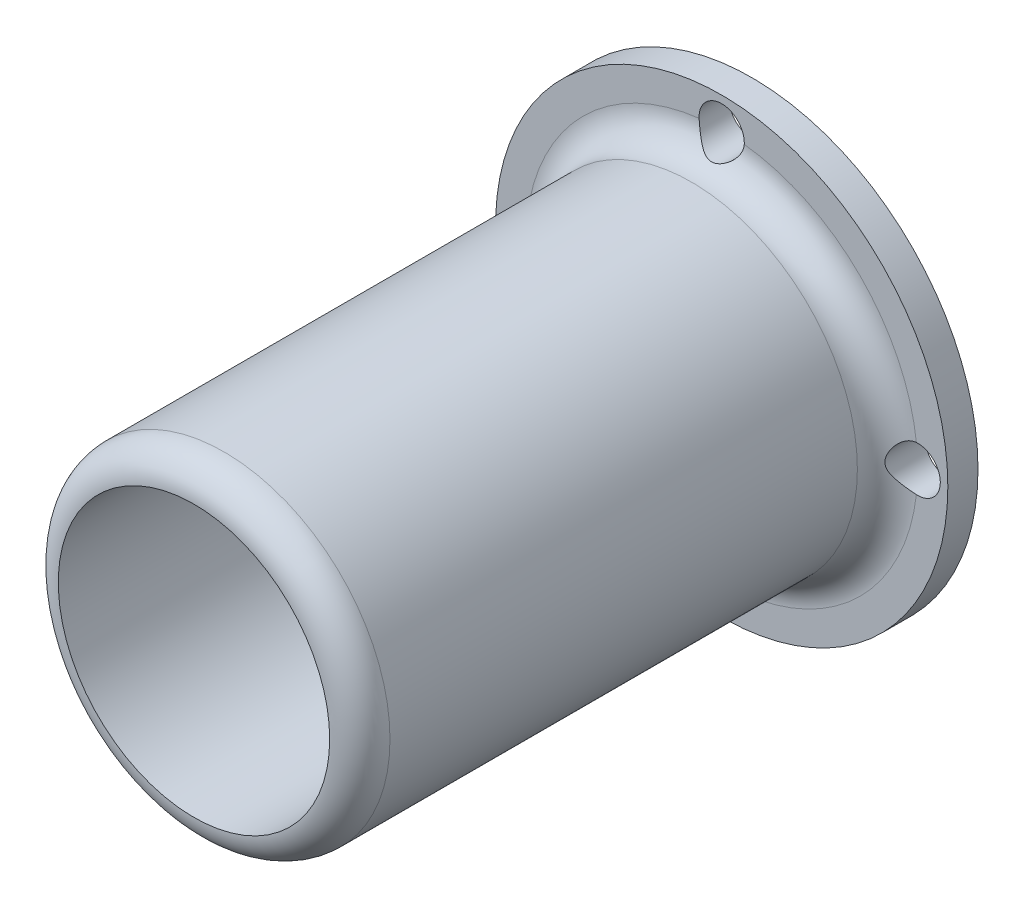
ISO-10303-21;
HEADER;
FILE_DESCRIPTION(('STEP AP214'),'2;1');
FILE_NAME('part.step','',(''),(''),'','','');
FILE_SCHEMA(('AUTOMOTIVE_DESIGN { 1 0 10303 214 1 1 1 1 }'));
ENDSEC;
DATA;
#1=APPLICATION_CONTEXT('core data for automotive mechanical design processes');
#2=APPLICATION_PROTOCOL_DEFINITION('international standard','automotive_design',2000,#1);
#3=PRODUCT_CONTEXT('',#1,'mechanical');
#4=PRODUCT('Part','Part','',(#3));
#5=PRODUCT_RELATED_PRODUCT_CATEGORY('part','',(#4));
#6=PRODUCT_DEFINITION_FORMATION('','',#4);
#7=PRODUCT_DEFINITION_CONTEXT('part definition',#1,'design');
#8=PRODUCT_DEFINITION('design','',#6,#7);
#9=PRODUCT_DEFINITION_SHAPE('','',#8);
#10=(LENGTH_UNIT() NAMED_UNIT(*) SI_UNIT(.MILLI.,.METRE.));
#11=(NAMED_UNIT(*) PLANE_ANGLE_UNIT() SI_UNIT($,.RADIAN.));
#12=(NAMED_UNIT(*) SI_UNIT($,.STERADIAN.) SOLID_ANGLE_UNIT());
#13=UNCERTAINTY_MEASURE_WITH_UNIT(LENGTH_MEASURE(1.E-05),#10,'distance_accuracy_value','');
#14=(GEOMETRIC_REPRESENTATION_CONTEXT(3) GLOBAL_UNCERTAINTY_ASSIGNED_CONTEXT((#13)) GLOBAL_UNIT_ASSIGNED_CONTEXT((#10,
#11,#12)) REPRESENTATION_CONTEXT('',''));
#15=CARTESIAN_POINT('',(0.,0.,0.));
#16=DIRECTION('',(0.,0.,1.));
#17=DIRECTION('',(1.,0.,0.));
#18=AXIS2_PLACEMENT_3D('',#15,#16,#17);
#19=CARTESIAN_POINT('',(0.,0.,2.));
#20=DIRECTION('',(0.,0.,-1.));
#21=DIRECTION('',(-1.,0.,0.));
#22=AXIS2_PLACEMENT_3D('',#19,#20,#21);
#23=CYLINDRICAL_SURFACE('',#22,15.);
#24=CARTESIAN_POINT('',(0.,0.,2.));
#25=DIRECTION('',(0.,0.,1.));
#26=DIRECTION('',(1.,0.,0.));
#27=AXIS2_PLACEMENT_3D('',#24,#25,#26);
#28=CIRCLE('',#27,15.);
#29=CARTESIAN_POINT('',(15.,0.,2.));
#30=VERTEX_POINT('',#29);
#31=EDGE_CURVE('E184',#30,#30,#28,.T.);
#32=ORIENTED_EDGE('',*,*,#31,.F.);
#33=EDGE_LOOP('',(#32));
#34=FACE_BOUND('',#33,.T.);
#35=CARTESIAN_POINT('',(0.,0.,0.));
#36=DIRECTION('',(0.,0.,1.));
#37=DIRECTION('',(1.,0.,0.));
#38=AXIS2_PLACEMENT_3D('',#35,#36,#37);
#39=CIRCLE('',#38,15.);
#40=CARTESIAN_POINT('',(15.,0.,0.));
#41=VERTEX_POINT('',#40);
#42=EDGE_CURVE('E187',#41,#41,#39,.T.);
#43=ORIENTED_EDGE('',*,*,#42,.T.);
#44=EDGE_LOOP('',(#43));
#45=FACE_BOUND('',#44,.T.);
#46=ADVANCED_FACE('F42',(#34,#45),#23,.T.);
#47=CARTESIAN_POINT('',(0.,0.,2.));
#48=DIRECTION('',(0.,0.,1.));
#49=DIRECTION('',(1.,0.,0.));
#50=AXIS2_PLACEMENT_3D('',#47,#48,#49);
#51=PLANE('',#50);
#52=CARTESIAN_POINT('',(0.,-13.,2.));
#53=DIRECTION('',(0.,0.,1.));
#54=DIRECTION('',(1.,0.,0.));
#55=AXIS2_PLACEMENT_3D('',#52,#53,#54);
#56=CIRCLE('',#55,1.5);
#57=CARTESIAN_POINT('',(-1.49750161758662,-12.9134615384615,2.));
#58=VERTEX_POINT('',#57);
#59=CARTESIAN_POINT('',(1.49750161758663,-12.9134615384615,2.));
#60=VERTEX_POINT('',#59);
#61=EDGE_CURVE('E212',#58,#60,#56,.T.);
#62=ORIENTED_EDGE('',*,*,#61,.F.);
#63=CARTESIAN_POINT('',(0.,0.,2.));
#64=DIRECTION('',(0.,0.,1.));
#65=DIRECTION('',(1.,0.,0.));
#66=AXIS2_PLACEMENT_3D('',#63,#64,#65);
#67=CIRCLE('',#66,13.);
#68=CARTESIAN_POINT('',(-12.9134615384615,-1.49750161758662,2.));
#69=VERTEX_POINT('',#68);
#70=EDGE_CURVE('E93',#58,#69,#67,.F.);
#71=ORIENTED_EDGE('',*,*,#70,.T.);
#72=CARTESIAN_POINT('',(-13.,0.,2.));
#73=DIRECTION('',(0.,0.,1.));
#74=DIRECTION('',(1.,0.,0.));
#75=AXIS2_PLACEMENT_3D('',#72,#73,#74);
#76=CIRCLE('',#75,1.5);
#77=CARTESIAN_POINT('',(-12.9134615384615,1.49750161758662,2.));
#78=VERTEX_POINT('',#77);
#79=EDGE_CURVE('E90',#78,#69,#76,.T.);
#80=ORIENTED_EDGE('',*,*,#79,.F.);
#81=CARTESIAN_POINT('',(0.,0.,2.));
#82=DIRECTION('',(0.,0.,1.));
#83=DIRECTION('',(1.,0.,0.));
#84=AXIS2_PLACEMENT_3D('',#81,#82,#83);
#85=CIRCLE('',#84,13.);
#86=CARTESIAN_POINT('',(-1.49750161758662,12.9134615384615,2.));
#87=VERTEX_POINT('',#86);
#88=EDGE_CURVE('E83',#78,#87,#85,.F.);
#89=ORIENTED_EDGE('',*,*,#88,.T.);
#90=CARTESIAN_POINT('',(0.,13.,2.));
#91=DIRECTION('',(0.,0.,1.));
#92=DIRECTION('',(1.,0.,0.));
#93=AXIS2_PLACEMENT_3D('',#90,#91,#92);
#94=CIRCLE('',#93,1.5);
#95=CARTESIAN_POINT('',(1.49750161758662,12.9134615384615,2.));
#96=VERTEX_POINT('',#95);
#97=EDGE_CURVE('E88',#96,#87,#94,.T.);
#98=ORIENTED_EDGE('',*,*,#97,.F.);
#99=CARTESIAN_POINT('',(0.,0.,2.));
#100=DIRECTION('',(0.,0.,1.));
#101=DIRECTION('',(1.,0.,0.));
#102=AXIS2_PLACEMENT_3D('',#99,#100,#101);
#103=CIRCLE('',#102,13.);
#104=CARTESIAN_POINT('',(12.9134615384615,1.49750161758662,2.));
#105=VERTEX_POINT('',#104);
#106=EDGE_CURVE('E94',#96,#105,#103,.F.);
#107=ORIENTED_EDGE('',*,*,#106,.T.);
#108=CARTESIAN_POINT('',(13.,0.,2.));
#109=DIRECTION('',(0.,0.,1.));
#110=DIRECTION('',(1.,0.,0.));
#111=AXIS2_PLACEMENT_3D('',#108,#109,#110);
#112=CIRCLE('',#111,1.5);
#113=CARTESIAN_POINT('',(12.9134615384615,-1.49750161758663,2.));
#114=VERTEX_POINT('',#113);
#115=EDGE_CURVE('E101',#114,#105,#112,.T.);
#116=ORIENTED_EDGE('',*,*,#115,.F.);
#117=CARTESIAN_POINT('',(0.,0.,2.));
#118=DIRECTION('',(0.,0.,1.));
#119=DIRECTION('',(1.,0.,0.));
#120=AXIS2_PLACEMENT_3D('',#117,#118,#119);
#121=CIRCLE('',#120,13.);
#122=EDGE_CURVE('E206',#114,#60,#121,.F.);
#123=ORIENTED_EDGE('',*,*,#122,.T.);
#124=EDGE_LOOP('',(#62,#71,#80,#89,#98,#107,#116,#123));
#125=FACE_BOUND('',#124,.T.);
#126=ORIENTED_EDGE('',*,*,#31,.T.);
#127=EDGE_LOOP('',(#126));
#128=FACE_BOUND('',#127,.T.);
#129=ADVANCED_FACE('F86',(#125,#128),#51,.T.);
#130=CARTESIAN_POINT('',(0.,0.,0.));
#131=DIRECTION('',(0.,0.,1.));
#132=DIRECTION('',(1.,0.,0.));
#133=AXIS2_PLACEMENT_3D('',#130,#131,#132);
#134=PLANE('',#133);
#135=CARTESIAN_POINT('',(0.,13.,0.));
#136=DIRECTION('',(0.,0.,1.));
#137=DIRECTION('',(1.,0.,0.));
#138=AXIS2_PLACEMENT_3D('',#135,#136,#137);
#139=CIRCLE('',#138,1.5);
#140=CARTESIAN_POINT('',(1.5,13.,0.));
#141=VERTEX_POINT('',#140);
#142=EDGE_CURVE('E100',#141,#141,#139,.T.);
#143=ORIENTED_EDGE('',*,*,#142,.T.);
#144=EDGE_LOOP('',(#143));
#145=FACE_BOUND('',#144,.T.);
#146=CARTESIAN_POINT('',(13.,0.,0.));
#147=DIRECTION('',(0.,0.,1.));
#148=DIRECTION('',(1.,0.,0.));
#149=AXIS2_PLACEMENT_3D('',#146,#147,#148);
#150=CIRCLE('',#149,1.5);
#151=CARTESIAN_POINT('',(14.5,0.,0.));
#152=VERTEX_POINT('',#151);
#153=EDGE_CURVE('E227',#152,#152,#150,.T.);
#154=ORIENTED_EDGE('',*,*,#153,.T.);
#155=EDGE_LOOP('',(#154));
#156=FACE_BOUND('',#155,.T.);
#157=CARTESIAN_POINT('',(0.,-13.,0.));
#158=DIRECTION('',(0.,0.,1.));
#159=DIRECTION('',(1.,0.,0.));
#160=AXIS2_PLACEMENT_3D('',#157,#158,#159);
#161=CIRCLE('',#160,1.5);
#162=CARTESIAN_POINT('',(1.50000000000001,-13.,0.));
#163=VERTEX_POINT('',#162);
#164=EDGE_CURVE('E215',#163,#163,#161,.T.);
#165=ORIENTED_EDGE('',*,*,#164,.T.);
#166=EDGE_LOOP('',(#165));
#167=FACE_BOUND('',#166,.T.);
#168=CARTESIAN_POINT('',(-13.,0.,0.));
#169=DIRECTION('',(0.,0.,1.));
#170=DIRECTION('',(1.,0.,0.));
#171=AXIS2_PLACEMENT_3D('',#168,#169,#170);
#172=CIRCLE('',#171,1.5);
#173=CARTESIAN_POINT('',(-11.5,0.,0.));
#174=VERTEX_POINT('',#173);
#175=EDGE_CURVE('E216',#174,#174,#172,.T.);
#176=ORIENTED_EDGE('',*,*,#175,.T.);
#177=EDGE_LOOP('',(#176));
#178=FACE_BOUND('',#177,.T.);
#179=ORIENTED_EDGE('',*,*,#42,.F.);
#180=EDGE_LOOP('',(#179));
#181=FACE_BOUND('',#180,.T.);
#182=ADVANCED_FACE('F166',(#145,#156,#167,#178,#181),#134,.F.);
#183=CARTESIAN_POINT('',(0.,0.,37.));
#184=DIRECTION('',(0.,0.,-1.));
#185=DIRECTION('',(-1.,0.,0.));
#186=AXIS2_PLACEMENT_3D('',#183,#184,#185);
#187=CYLINDRICAL_SURFACE('',#186,11.);
#188=CARTESIAN_POINT('',(0.,0.,4.));
#189=DIRECTION('',(0.,0.,1.));
#190=DIRECTION('',(1.,0.,0.));
#191=AXIS2_PLACEMENT_3D('',#188,#189,#190);
#192=CIRCLE('',#191,11.);
#193=CARTESIAN_POINT('',(11.,0.,4.));
#194=VERTEX_POINT('',#193);
#195=EDGE_CURVE('E202',#194,#194,#192,.T.);
#196=ORIENTED_EDGE('',*,*,#195,.T.);
#197=EDGE_LOOP('',(#196));
#198=FACE_BOUND('',#197,.T.);
#199=CARTESIAN_POINT('',(0.,0.,35.));
#200=DIRECTION('',(0.,0.,1.));
#201=DIRECTION('',(1.,0.,0.));
#202=AXIS2_PLACEMENT_3D('',#199,#200,#201);
#203=CIRCLE('',#202,11.);
#204=CARTESIAN_POINT('',(11.,0.,35.));
#205=VERTEX_POINT('',#204);
#206=EDGE_CURVE('E194',#205,#205,#203,.F.);
#207=ORIENTED_EDGE('',*,*,#206,.T.);
#208=EDGE_LOOP('',(#207));
#209=FACE_BOUND('',#208,.T.);
#210=ADVANCED_FACE('F162',(#198,#209),#187,.T.);
#211=CARTESIAN_POINT('',(0.,0.,37.));
#212=DIRECTION('',(0.,0.,-1.));
#213=DIRECTION('',(-1.,0.,0.));
#214=AXIS2_PLACEMENT_3D('',#211,#212,#213);
#215=CYLINDRICAL_SURFACE('',#214,9.);
#216=CARTESIAN_POINT('',(0.,0.,4.));
#217=DIRECTION('',(0.,0.,1.));
#218=DIRECTION('',(1.,0.,0.));
#219=AXIS2_PLACEMENT_3D('',#216,#217,#218);
#220=CIRCLE('',#219,9.);
#221=CARTESIAN_POINT('',(9.,0.,4.));
#222=VERTEX_POINT('',#221);
#223=EDGE_CURVE('E51',#222,#222,#220,.F.);
#224=ORIENTED_EDGE('',*,*,#223,.T.);
#225=EDGE_LOOP('',(#224));
#226=FACE_BOUND('',#225,.T.);
#227=CARTESIAN_POINT('',(0.,0.,37.));
#228=DIRECTION('',(0.,0.,1.));
#229=DIRECTION('',(1.,0.,0.));
#230=AXIS2_PLACEMENT_3D('',#227,#228,#229);
#231=CIRCLE('',#230,9.);
#232=CARTESIAN_POINT('',(9.,0.,37.));
#233=VERTEX_POINT('',#232);
#234=EDGE_CURVE('E190',#233,#233,#231,.T.);
#235=ORIENTED_EDGE('',*,*,#234,.T.);
#236=EDGE_LOOP('',(#235));
#237=FACE_BOUND('',#236,.T.);
#238=ADVANCED_FACE('F159',(#226,#237),#215,.F.);
#239=CARTESIAN_POINT('',(0.,0.,2.));
#240=DIRECTION('',(0.,0.,1.));
#241=DIRECTION('',(1.,0.,0.));
#242=AXIS2_PLACEMENT_3D('',#239,#240,#241);
#243=CIRCLE('',#242,7.);
#244=CARTESIAN_POINT('',(7.,0.,2.));
#245=VERTEX_POINT('',#244);
#246=EDGE_CURVE('E11',#245,#245,#243,.T.);
#247=ORIENTED_EDGE('',*,*,#246,.T.);
#248=EDGE_LOOP('',(#247));
#249=FACE_BOUND('',#248,.T.);
#250=ADVANCED_FACE('F157',(#249),#51,.T.);
#251=CARTESIAN_POINT('',(-13.,0.,0.));
#252=DIRECTION('',(0.,0.,1.));
#253=DIRECTION('',(1.,0.,0.));
#254=AXIS2_PLACEMENT_3D('',#251,#252,#253);
#255=CYLINDRICAL_SURFACE('',#254,1.5);
#256=ORIENTED_EDGE('',*,*,#175,.F.);
#257=EDGE_LOOP('',(#256));
#258=FACE_BOUND('',#257,.T.);
#259=ORIENTED_EDGE('',*,*,#79,.T.);
#260=CARTESIAN_POINT('',(-12.9134615384615,-1.49750161758662,2.));
#261=CARTESIAN_POINT('',(-12.877009018722,-1.49540283482481,1.99999163281631));
#262=CARTESIAN_POINT('',(-12.8406386167071,-1.49195812209591,2.00099626463129));
#263=CARTESIAN_POINT('',(-12.7683717650644,-1.48245394178641,2.00499423906616));
#264=CARTESIAN_POINT('',(-12.7324750613002,-1.47639594032702,2.00798646710158));
#265=CARTESIAN_POINT('',(-12.6616733619168,-1.461791241406,2.01589454757905));
#266=CARTESIAN_POINT('',(-12.6267631715092,-1.45326232369453,2.02079674065199));
#267=CARTESIAN_POINT('',(-12.5579311983879,-1.43382560878669,2.03242884774616));
#268=CARTESIAN_POINT('',(-12.524009502861,-1.42291760246675,2.03915892245224));
#269=CARTESIAN_POINT('',(-12.4241911966319,-1.38687769134638,2.06188608742498));
#270=CARTESIAN_POINT('',(-12.3600449920152,-1.35838844166775,2.08044299156179));
#271=CARTESIAN_POINT('',(-12.237731482658,-1.29373697876735,2.12307779942354));
#272=CARTESIAN_POINT('',(-12.179573454183,-1.25756311915106,2.14716408771402));
#273=CARTESIAN_POINT('',(-12.0516338378167,-1.16563206824097,2.20800922802985));
#274=CARTESIAN_POINT('',(-11.9843985599082,-1.1073596046182,2.24632110837275));
#275=CARTESIAN_POINT('',(-11.8618595939187,-0.981036030836239,2.32640233292436));
#276=CARTESIAN_POINT('',(-11.8065990859191,-0.91295095927186,2.36818346204169));
#277=CARTESIAN_POINT('',(-11.7326028887683,-0.803540618601406,2.43038562914621));
#278=CARTESIAN_POINT('',(-11.7092611075828,-0.765502358233746,2.45121592193061));
#279=CARTESIAN_POINT('',(-11.6658635332372,-0.687091650578312,2.49187215024841));
#280=CARTESIAN_POINT('',(-11.6458089977205,-0.646718317886614,2.51169769938965));
#281=CARTESIAN_POINT('',(-11.5909925337174,-0.522356468912271,2.56822774637433));
#282=CARTESIAN_POINT('',(-11.5612448733653,-0.434641454284661,2.60228373581109));
#283=CARTESIAN_POINT('',(-11.5275141887913,-0.290881972036377,2.64255495621849));
#284=CARTESIAN_POINT('',(-11.5179528146036,-0.237731241490452,2.65443368658005));
#285=CARTESIAN_POINT('',(-11.5046276859605,-0.129655714860702,2.67116564280565));
#286=CARTESIAN_POINT('',(-11.5008520553771,-0.0747347897679379,2.67603325882173));
#287=CARTESIAN_POINT('',(-11.4994045405648,0.0354979034259465,2.67788656315514));
#288=CARTESIAN_POINT('',(-11.5017516971631,0.0908103560214856,2.67484766363014));
#289=CARTESIAN_POINT('',(-11.5123748158736,0.199980902751082,2.6614093847542));
#290=CARTESIAN_POINT('',(-11.5206608163404,0.253836374005691,2.65099754336854));
#291=CARTESIAN_POINT('',(-11.5463621058973,0.377028137155964,2.61987097380865));
#292=CARTESIAN_POINT('',(-11.5659382965487,0.445310751735083,2.59684327081914));
#293=CARTESIAN_POINT('',(-11.6134405754617,0.576499705700897,2.54473397531436));
#294=CARTESIAN_POINT('',(-11.6413938843048,0.63938764545666,2.51563274253241));
#295=CARTESIAN_POINT('',(-11.7165052964225,0.781854294521131,2.4436531715643));
#296=CARTESIAN_POINT('',(-11.7669481298673,0.859124382745761,2.39962896102397));
#297=CARTESIAN_POINT('',(-11.881350302787,1.00353494729288,2.31272360832546));
#298=CARTESIAN_POINT('',(-11.9452968321864,1.07068492117607,2.2698414259107));
#299=CARTESIAN_POINT('',(-12.0724943248197,1.18124717540933,2.19778766840918));
#300=CARTESIAN_POINT('',(-12.1333574385442,1.22672478085569,2.16758503755113));
#301=CARTESIAN_POINT('',(-12.2632008695964,1.30881752618183,2.11312592840941));
#302=CARTESIAN_POINT('',(-12.3321708278936,1.34544379729766,2.08886198127662));
#303=CARTESIAN_POINT('',(-12.4666411558364,1.40360546742969,2.05119914901576));
#304=CARTESIAN_POINT('',(-12.5312369582164,1.42654713106864,2.03674507788934));
#305=CARTESIAN_POINT('',(-12.6640118767832,1.46350055966239,2.01471229357911));
#306=CARTESIAN_POINT('',(-12.7321835009406,1.47753024677737,2.00711976860261));
#307=CARTESIAN_POINT('',(-12.8197486608955,1.4892504978664,2.00212203363385));
#308=CARTESIAN_POINT('',(-12.8384482795188,1.4913943823278,2.00132566908444));
#309=CARTESIAN_POINT('',(-12.8759099798841,1.49497612384243,2.00026539600251));
#310=CARTESIAN_POINT('',(-12.894671973964,1.49641472989904,2.00000092167392));
#311=CARTESIAN_POINT('',(-12.9134615384615,1.49750161758662,2.));
#312=B_SPLINE_CURVE_WITH_KNOTS('',3,(#260,#261,#262,#263,#264,#265,#266,#267,#268,#269,#270,
#271,#272,#273,#274,#275,#276,#277,#278,#279,#280,#281,#282,#283,#284,#285,#286,#287,#288,#289,
#290,#291,#292,#293,#294,#295,#296,#297,#298,#299,#300,#301,#302,#303,#304,#305,#306,#307,#308,
#309,#310,#311),.UNSPECIFIED.,.F.,.F.,(4,2,2,2,2,2,2,2,2,2,2,2,2,2,2,2,2,2,2,2,2,2,2,2,2,4),(0.,
0.10949289321473,0.218924437868614,0.327587323941365,0.436259765410941,0.653006570954559,
0.870084240536853,1.15919083653543,1.44932319257692,1.59691338795534,1.74455991766341,
2.03789771133033,2.20315834495662,2.36807929918092,2.53351374051453,2.69922847511232,
2.92199543450572,3.14549424890554,3.4507420072986,3.75570148751516,4.00004897024524,
4.24408754918198,4.45337382091025,4.66223787015601,4.71874127276779,4.77518453825551),.UNSPECIFIED.);
#313=EDGE_CURVE('E58',#69,#78,#312,.T.);
#314=ORIENTED_EDGE('',*,*,#313,.T.);
#315=EDGE_LOOP('',(#259,#314));
#316=FACE_BOUND('',#315,.T.);
#317=ADVANCED_FACE('F151',(#258,#316),#255,.F.);
#318=CARTESIAN_POINT('',(0.,-13.,0.));
#319=DIRECTION('',(0.,0.,1.));
#320=DIRECTION('',(1.,0.,0.));
#321=AXIS2_PLACEMENT_3D('',#318,#319,#320);
#322=CYLINDRICAL_SURFACE('',#321,1.5);
#323=ORIENTED_EDGE('',*,*,#164,.F.);
#324=EDGE_LOOP('',(#323));
#325=FACE_BOUND('',#324,.T.);
#326=ORIENTED_EDGE('',*,*,#61,.T.);
#327=CARTESIAN_POINT('',(1.49750161758663,-12.9134615384615,2.));
#328=CARTESIAN_POINT('',(1.49540283482482,-12.877009018722,1.99999163281631));
#329=CARTESIAN_POINT('',(1.49195812209592,-12.8406386167071,2.00099626463129));
#330=CARTESIAN_POINT('',(1.48245394178642,-12.7683717650644,2.00499423906616));
#331=CARTESIAN_POINT('',(1.47639594032703,-12.7324750613002,2.00798646710158));
#332=CARTESIAN_POINT('',(1.46179124140601,-12.6616733619168,2.01589454757905));
#333=CARTESIAN_POINT('',(1.45326232369454,-12.6267631715092,2.02079674065199));
#334=CARTESIAN_POINT('',(1.4338256087867,-12.5579311983879,2.03242884774616));
#335=CARTESIAN_POINT('',(1.42291760246675,-12.524009502861,2.03915892245224));
#336=CARTESIAN_POINT('',(1.38687769134639,-12.4241911966319,2.06188608742498));
#337=CARTESIAN_POINT('',(1.35838844166776,-12.3600449920152,2.08044299156179));
#338=CARTESIAN_POINT('',(1.29373697876736,-12.237731482658,2.12307779942354));
#339=CARTESIAN_POINT('',(1.25756311915106,-12.179573454183,2.14716408771402));
#340=CARTESIAN_POINT('',(1.16563206824098,-12.0516338378167,2.20800922802985));
#341=CARTESIAN_POINT('',(1.10735960461821,-11.9843985599082,2.24632110837275));
#342=CARTESIAN_POINT('',(0.981036030836243,-11.8618595939187,2.32640233292436));
#343=CARTESIAN_POINT('',(0.912950959271864,-11.8065990859191,2.36818346204169));
#344=CARTESIAN_POINT('',(0.803540618601409,-11.7326028887683,2.43038562914621));
#345=CARTESIAN_POINT('',(0.765502358233749,-11.7092611075828,2.45121592193061));
#346=CARTESIAN_POINT('',(0.687091650578315,-11.6658635332372,2.49187215024841));
#347=CARTESIAN_POINT('',(0.646718317886617,-11.6458089977205,2.51169769938965));
#348=CARTESIAN_POINT('',(0.522356468912275,-11.5909925337174,2.56822774637433));
#349=CARTESIAN_POINT('',(0.434641454284663,-11.5612448733653,2.60228373581109));
#350=CARTESIAN_POINT('',(0.290881972036378,-11.5275141887913,2.64255495621849));
#351=CARTESIAN_POINT('',(0.237731241490453,-11.5179528146036,2.65443368658005));
#352=CARTESIAN_POINT('',(0.129655714860704,-11.5046276859605,2.67116564280565));
#353=CARTESIAN_POINT('',(0.0747347897679388,-11.5008520553771,2.67603325882173));
#354=CARTESIAN_POINT('',(-0.0354979034259456,-11.4994045405648,2.67788656315514));
#355=CARTESIAN_POINT('',(-0.0908103560214847,-11.5017516971631,2.67484766363014));
#356=CARTESIAN_POINT('',(-0.199980902751082,-11.5123748158736,2.6614093847542));
#357=CARTESIAN_POINT('',(-0.253836374005691,-11.5206608163405,2.65099754336854));
#358=CARTESIAN_POINT('',(-0.377028137155963,-11.5463621058973,2.61987097380865));
#359=CARTESIAN_POINT('',(-0.445310751735083,-11.5659382965487,2.59684327081914));
#360=CARTESIAN_POINT('',(-0.576499705700897,-11.6134405754617,2.54473397531436));
#361=CARTESIAN_POINT('',(-0.639387645456662,-11.6413938843048,2.51563274253241));
#362=CARTESIAN_POINT('',(-0.781854294521132,-11.7165052964225,2.4436531715643));
#363=CARTESIAN_POINT('',(-0.859124382745761,-11.7669481298673,2.39962896102397));
#364=CARTESIAN_POINT('',(-1.00353494729288,-11.881350302787,2.31272360832546));
#365=CARTESIAN_POINT('',(-1.07068492117607,-11.9452968321864,2.2698414259107));
#366=CARTESIAN_POINT('',(-1.18124717540933,-12.0724943248197,2.19778766840918));
#367=CARTESIAN_POINT('',(-1.22672478085569,-12.1333574385442,2.16758503755113));
#368=CARTESIAN_POINT('',(-1.30881752618183,-12.2632008695964,2.11312592840941));
#369=CARTESIAN_POINT('',(-1.34544379729765,-12.3321708278936,2.08886198127662));
#370=CARTESIAN_POINT('',(-1.40360546742968,-12.4666411558364,2.05119914901576));
#371=CARTESIAN_POINT('',(-1.42654713106864,-12.5312369582164,2.03674507788934));
#372=CARTESIAN_POINT('',(-1.46350055966238,-12.6640118767832,2.01471229357911));
#373=CARTESIAN_POINT('',(-1.47753024677736,-12.7321835009406,2.00711976860261));
#374=CARTESIAN_POINT('',(-1.48925049786639,-12.8197486608955,2.00212203363385));
#375=CARTESIAN_POINT('',(-1.4913943823278,-12.8384482795188,2.00132566908444));
#376=CARTESIAN_POINT('',(-1.49497612384243,-12.8759099798841,2.00026539600251));
#377=CARTESIAN_POINT('',(-1.49641472989904,-12.894671973964,2.00000092167392));
#378=CARTESIAN_POINT('',(-1.49750161758662,-12.9134615384615,2.));
#379=B_SPLINE_CURVE_WITH_KNOTS('',3,(#327,#328,#329,#330,#331,#332,#333,#334,#335,#336,#337,
#338,#339,#340,#341,#342,#343,#344,#345,#346,#347,#348,#349,#350,#351,#352,#353,#354,#355,#356,
#357,#358,#359,#360,#361,#362,#363,#364,#365,#366,#367,#368,#369,#370,#371,#372,#373,#374,#375,
#376,#377,#378),.UNSPECIFIED.,.F.,.F.,(4,2,2,2,2,2,2,2,2,2,2,2,2,2,2,2,2,2,2,2,2,2,2,2,2,4),(0.,
0.10949289321473,0.218924437868614,0.327587323941362,0.436259765410942,0.653006570954559,
0.870084240536853,1.15919083653543,1.44932319257692,1.59691338795534,1.74455991766341,
2.03789771133034,2.20315834495662,2.36807929918092,2.53351374051453,2.69922847511232,
2.92199543450573,3.14549424890554,3.45074200729861,3.75570148751516,4.00004897024525,
4.24408754918199,4.45337382091026,4.66223787015601,4.71874127276779,4.7751845382555),.UNSPECIFIED.);
#380=EDGE_CURVE('E111',#60,#58,#379,.T.);
#381=ORIENTED_EDGE('',*,*,#380,.T.);
#382=EDGE_LOOP('',(#326,#381));
#383=FACE_BOUND('',#382,.T.);
#384=ADVANCED_FACE('F147',(#325,#383),#322,.F.);
#385=CARTESIAN_POINT('',(13.,0.,0.));
#386=DIRECTION('',(0.,0.,1.));
#387=DIRECTION('',(1.,0.,0.));
#388=AXIS2_PLACEMENT_3D('',#385,#386,#387);
#389=CYLINDRICAL_SURFACE('',#388,1.5);
#390=ORIENTED_EDGE('',*,*,#153,.F.);
#391=EDGE_LOOP('',(#390));
#392=FACE_BOUND('',#391,.T.);
#393=ORIENTED_EDGE('',*,*,#115,.T.);
#394=CARTESIAN_POINT('',(12.9134615384615,1.49750161758662,2.));
#395=CARTESIAN_POINT('',(12.877009018722,1.49540283482481,1.99999163281631));
#396=CARTESIAN_POINT('',(12.8406386167071,1.49195812209591,2.00099626463129));
#397=CARTESIAN_POINT('',(12.7683717650644,1.48245394178641,2.00499423906616));
#398=CARTESIAN_POINT('',(12.7324750613002,1.47639594032702,2.00798646710158));
#399=CARTESIAN_POINT('',(12.6616733619168,1.461791241406,2.01589454757905));
#400=CARTESIAN_POINT('',(12.6267631715092,1.45326232369453,2.02079674065199));
#401=CARTESIAN_POINT('',(12.5579311983879,1.43382560878669,2.03242884774616));
#402=CARTESIAN_POINT('',(12.524009502861,1.42291760246674,2.03915892245224));
#403=CARTESIAN_POINT('',(12.4241911966319,1.38687769134638,2.06188608742498));
#404=CARTESIAN_POINT('',(12.3600449920152,1.35838844166774,2.08044299156179));
#405=CARTESIAN_POINT('',(12.237731482658,1.29373697876735,2.12307779942354));
#406=CARTESIAN_POINT('',(12.179573454183,1.25756311915105,2.14716408771402));
#407=CARTESIAN_POINT('',(12.0516338378167,1.16563206824096,2.20800922802985));
#408=CARTESIAN_POINT('',(11.9843985599082,1.10735960461819,2.24632110837275));
#409=CARTESIAN_POINT('',(11.8618595939187,0.98103603083623,2.32640233292436));
#410=CARTESIAN_POINT('',(11.8065990859191,0.912950959271849,2.36818346204169));
#411=CARTESIAN_POINT('',(11.7326028887683,0.803540618601394,2.43038562914621));
#412=CARTESIAN_POINT('',(11.7092611075828,0.765502358233734,2.45121592193061));
#413=CARTESIAN_POINT('',(11.6658635332372,0.6870916505783,2.49187215024841));
#414=CARTESIAN_POINT('',(11.6458089977205,0.646718317886602,2.51169769938965));
#415=CARTESIAN_POINT('',(11.5909925337174,0.522356468912259,2.56822774637433));
#416=CARTESIAN_POINT('',(11.5612448733653,0.434641454284647,2.60228373581109));
#417=CARTESIAN_POINT('',(11.5275141887913,0.290881972036363,2.64255495621849));
#418=CARTESIAN_POINT('',(11.5179528146036,0.237731241490437,2.65443368658005));
#419=CARTESIAN_POINT('',(11.5046276859605,0.129655714860687,2.67116564280564));
#420=CARTESIAN_POINT('',(11.5008520553771,0.0747347897679225,2.67603325882173));
#421=CARTESIAN_POINT('',(11.4994045405648,-0.0354979034259622,2.67788656315514));
#422=CARTESIAN_POINT('',(11.5017516971631,-0.0908103560215015,2.67484766363014));
#423=CARTESIAN_POINT('',(11.5123748158736,-0.199980902751098,2.6614093847542));
#424=CARTESIAN_POINT('',(11.5206608163405,-0.253836374005707,2.65099754336854));
#425=CARTESIAN_POINT('',(11.5463621058973,-0.37702813715598,2.61987097380865));
#426=CARTESIAN_POINT('',(11.5659382965487,-0.4453107517351,2.59684327081913));
#427=CARTESIAN_POINT('',(11.6134405754617,-0.576499705700915,2.54473397531436));
#428=CARTESIAN_POINT('',(11.6413938843048,-0.639387645456679,2.5156327425324));
#429=CARTESIAN_POINT('',(11.7165052964225,-0.78185429452115,2.44365317156429));
#430=CARTESIAN_POINT('',(11.7669481298673,-0.859124382745779,2.39962896102396));
#431=CARTESIAN_POINT('',(11.8813503027871,-1.0035349472929,2.31272360832545));
#432=CARTESIAN_POINT('',(11.9452968321864,-1.07068492117609,2.26984142591069));
#433=CARTESIAN_POINT('',(12.0724943248197,-1.18124717540935,2.19778766840917));
#434=CARTESIAN_POINT('',(12.1333574385442,-1.2267247808557,2.16758503755112));
#435=CARTESIAN_POINT('',(12.2632008695964,-1.30881752618184,2.1131259284094));
#436=CARTESIAN_POINT('',(12.3321708278936,-1.34544379729767,2.08886198127662));
#437=CARTESIAN_POINT('',(12.4666411558364,-1.4036054674297,2.05119914901576));
#438=CARTESIAN_POINT('',(12.5312369582164,-1.42654713106865,2.03674507788934));
#439=CARTESIAN_POINT('',(12.6640118767832,-1.46350055966239,2.01471229357911));
#440=CARTESIAN_POINT('',(12.7321835009406,-1.47753024677737,2.0071197686026));
#441=CARTESIAN_POINT('',(12.8197486608955,-1.48925049786641,2.00212203363385));
#442=CARTESIAN_POINT('',(12.8384482795188,-1.49139438232781,2.00132566908444));
#443=CARTESIAN_POINT('',(12.8759099798841,-1.49497612384244,2.00026539600251));
#444=CARTESIAN_POINT('',(12.894671973964,-1.49641472989905,2.00000092167392));
#445=CARTESIAN_POINT('',(12.9134615384615,-1.49750161758663,2.));
#446=B_SPLINE_CURVE_WITH_KNOTS('',3,(#394,#395,#396,#397,#398,#399,#400,#401,#402,#403,#404,
#405,#406,#407,#408,#409,#410,#411,#412,#413,#414,#415,#416,#417,#418,#419,#420,#421,#422,#423,
#424,#425,#426,#427,#428,#429,#430,#431,#432,#433,#434,#435,#436,#437,#438,#439,#440,#441,#442,
#443,#444,#445),.UNSPECIFIED.,.F.,.F.,(4,2,2,2,2,2,2,2,2,2,2,2,2,2,2,2,2,2,2,2,2,2,2,2,2,4),(0.,
0.109492893214731,0.218924437868616,0.327587323941364,0.436259765410944,0.653006570954561,
0.870084240536856,1.15919083653544,1.44932319257693,1.59691338795534,1.74455991766342,
2.03789771133034,2.20315834495662,2.36807929918092,2.53351374051454,2.69922847511232,
2.92199543450573,3.14549424890555,3.45074200729861,3.75570148751517,4.00004897024525,
4.24408754918199,4.45337382091026,4.66223787015601,4.71874127276779,4.7751845382555),.UNSPECIFIED.);
#447=EDGE_CURVE('E107',#105,#114,#446,.T.);
#448=ORIENTED_EDGE('',*,*,#447,.T.);
#449=EDGE_LOOP('',(#393,#448));
#450=FACE_BOUND('',#449,.T.);
#451=ADVANCED_FACE('F150',(#392,#450),#389,.F.);
#452=CARTESIAN_POINT('',(0.,13.,0.));
#453=DIRECTION('',(0.,0.,1.));
#454=DIRECTION('',(1.,0.,0.));
#455=AXIS2_PLACEMENT_3D('',#452,#453,#454);
#456=CYLINDRICAL_SURFACE('',#455,1.5);
#457=ORIENTED_EDGE('',*,*,#142,.F.);
#458=EDGE_LOOP('',(#457));
#459=FACE_BOUND('',#458,.T.);
#460=ORIENTED_EDGE('',*,*,#97,.T.);
#461=CARTESIAN_POINT('',(-1.49750161758662,12.9134615384615,2.));
#462=CARTESIAN_POINT('',(-1.49540283482481,12.877009018722,1.99999163281631));
#463=CARTESIAN_POINT('',(-1.49195812209591,12.8406386167071,2.00099626463129));
#464=CARTESIAN_POINT('',(-1.48245394178641,12.7683717650644,2.00499423906616));
#465=CARTESIAN_POINT('',(-1.47639594032702,12.7324750613002,2.00798646710158));
#466=CARTESIAN_POINT('',(-1.461791241406,12.6616733619168,2.01589454757905));
#467=CARTESIAN_POINT('',(-1.45326232369453,12.6267631715092,2.02079674065199));
#468=CARTESIAN_POINT('',(-1.43382560878669,12.5579311983879,2.03242884774616));
#469=CARTESIAN_POINT('',(-1.42291760246675,12.524009502861,2.03915892245224));
#470=CARTESIAN_POINT('',(-1.38687769134638,12.4241911966319,2.06188608742498));
#471=CARTESIAN_POINT('',(-1.35838844166775,12.3600449920152,2.08044299156179));
#472=CARTESIAN_POINT('',(-1.29373697876735,12.237731482658,2.12307779942354));
#473=CARTESIAN_POINT('',(-1.25756311915106,12.179573454183,2.14716408771402));
#474=CARTESIAN_POINT('',(-1.16563206824097,12.0516338378167,2.20800922802985));
#475=CARTESIAN_POINT('',(-1.1073596046182,11.9843985599082,2.24632110837275));
#476=CARTESIAN_POINT('',(-0.981036030836237,11.8618595939187,2.32640233292436));
#477=CARTESIAN_POINT('',(-0.912950959271858,11.8065990859191,2.36818346204169));
#478=CARTESIAN_POINT('',(-0.803540618601402,11.7326028887683,2.43038562914621));
#479=CARTESIAN_POINT('',(-0.765502358233741,11.7092611075828,2.45121592193061));
#480=CARTESIAN_POINT('',(-0.687091650578308,11.6658635332372,2.49187215024841));
#481=CARTESIAN_POINT('',(-0.64671831788661,11.6458089977205,2.51169769938965));
#482=CARTESIAN_POINT('',(-0.522356468912268,11.5909925337174,2.56822774637433));
#483=CARTESIAN_POINT('',(-0.434641454284658,11.5612448733653,2.60228373581109));
#484=CARTESIAN_POINT('',(-0.290881972036373,11.5275141887913,2.64255495621849));
#485=CARTESIAN_POINT('',(-0.237731241490448,11.5179528146036,2.65443368658005));
#486=CARTESIAN_POINT('',(-0.129655714860698,11.5046276859605,2.67116564280565));
#487=CARTESIAN_POINT('',(-0.0747347897679337,11.5008520553771,2.67603325882173));
#488=CARTESIAN_POINT('',(0.0354979034259507,11.4994045405648,2.67788656315514));
#489=CARTESIAN_POINT('',(0.0908103560214897,11.5017516971631,2.67484766363014));
#490=CARTESIAN_POINT('',(0.199980902751086,11.5123748158736,2.6614093847542));
#491=CARTESIAN_POINT('',(0.253836374005696,11.5206608163404,2.65099754336854));
#492=CARTESIAN_POINT('',(0.377028137155968,11.5463621058973,2.61987097380865));
#493=CARTESIAN_POINT('',(0.445310751735088,11.5659382965487,2.59684327081914));
#494=CARTESIAN_POINT('',(0.576499705700902,11.6134405754617,2.54473397531436));
#495=CARTESIAN_POINT('',(0.639387645456665,11.6413938843048,2.51563274253241));
#496=CARTESIAN_POINT('',(0.781854294521136,11.7165052964225,2.4436531715643));
#497=CARTESIAN_POINT('',(0.859124382745766,11.7669481298673,2.39962896102397));
#498=CARTESIAN_POINT('',(1.00353494729289,11.881350302787,2.31272360832546));
#499=CARTESIAN_POINT('',(1.07068492117608,11.9452968321864,2.2698414259107));
#500=CARTESIAN_POINT('',(1.18124717540933,12.0724943248197,2.19778766840918));
#501=CARTESIAN_POINT('',(1.22672478085569,12.1333574385442,2.16758503755113));
#502=CARTESIAN_POINT('',(1.30881752618183,12.2632008695964,2.11312592840941));
#503=CARTESIAN_POINT('',(1.34544379729766,12.3321708278936,2.08886198127662));
#504=CARTESIAN_POINT('',(1.40360546742969,12.4666411558364,2.05119914901576));
#505=CARTESIAN_POINT('',(1.42654713106864,12.5312369582164,2.03674507788934));
#506=CARTESIAN_POINT('',(1.46350055966239,12.6640118767832,2.01471229357911));
#507=CARTESIAN_POINT('',(1.47753024677737,12.7321835009406,2.00711976860261));
#508=CARTESIAN_POINT('',(1.4892504978664,12.8197486608955,2.00212203363385));
#509=CARTESIAN_POINT('',(1.49139438232781,12.8384482795188,2.00132566908444));
#510=CARTESIAN_POINT('',(1.49497612384244,12.8759099798841,2.00026539600251));
#511=CARTESIAN_POINT('',(1.49641472989905,12.894671973964,2.00000092167392));
#512=CARTESIAN_POINT('',(1.49750161758662,12.9134615384615,2.));
#513=B_SPLINE_CURVE_WITH_KNOTS('',3,(#461,#462,#463,#464,#465,#466,#467,#468,#469,#470,#471,
#472,#473,#474,#475,#476,#477,#478,#479,#480,#481,#482,#483,#484,#485,#486,#487,#488,#489,#490,
#491,#492,#493,#494,#495,#496,#497,#498,#499,#500,#501,#502,#503,#504,#505,#506,#507,#508,#509,
#510,#511,#512),.UNSPECIFIED.,.F.,.F.,(4,2,2,2,2,2,2,2,2,2,2,2,2,2,2,2,2,2,2,2,2,2,2,2,2,4),(0.,
0.10949289321473,0.218924437868614,0.327587323941362,0.436259765410942,0.653006570954559,
0.870084240536853,1.15919083653543,1.44932319257693,1.59691338795534,1.74455991766341,
2.03789771133034,2.20315834495662,2.36807929918092,2.53351374051453,2.69922847511232,
2.92199543450573,3.14549424890554,3.45074200729861,3.75570148751516,4.00004897024524,
4.24408754918199,4.45337382091026,4.66223787015601,4.71874127276779,4.77518453825551),.UNSPECIFIED.);
#514=EDGE_CURVE('E98',#87,#96,#513,.T.);
#515=ORIENTED_EDGE('',*,*,#514,.T.);
#516=EDGE_LOOP('',(#460,#515));
#517=FACE_BOUND('',#516,.T.);
#518=ADVANCED_FACE('F97',(#459,#517),#456,.F.);
#519=CARTESIAN_POINT('',(0.,0.,4.));
#520=DIRECTION('',(0.,0.,1.));
#521=DIRECTION('',(1.,0.,0.));
#522=AXIS2_PLACEMENT_3D('',#519,#520,#521);
#523=TOROIDAL_SURFACE('',#522,13.,2.);
#524=ORIENTED_EDGE('',*,*,#313,.F.);
#525=ORIENTED_EDGE('',*,*,#70,.F.);
#526=ORIENTED_EDGE('',*,*,#380,.F.);
#527=ORIENTED_EDGE('',*,*,#122,.F.);
#528=ORIENTED_EDGE('',*,*,#447,.F.);
#529=ORIENTED_EDGE('',*,*,#106,.F.);
#530=ORIENTED_EDGE('',*,*,#514,.F.);
#531=ORIENTED_EDGE('',*,*,#88,.F.);
#532=EDGE_LOOP('',(#524,#525,#526,#527,#528,#529,#530,#531));
#533=FACE_BOUND('',#532,.T.);
#534=ORIENTED_EDGE('',*,*,#195,.F.);
#535=EDGE_LOOP('',(#534));
#536=FACE_BOUND('',#535,.T.);
#537=ADVANCED_FACE('F103',(#533,#536),#523,.F.);
#538=CARTESIAN_POINT('',(0.,0.,35.));
#539=DIRECTION('',(0.,0.,1.));
#540=DIRECTION('',(1.,0.,0.));
#541=AXIS2_PLACEMENT_3D('',#538,#539,#540);
#542=TOROIDAL_SURFACE('',#541,9.,2.);
#543=ORIENTED_EDGE('',*,*,#206,.F.);
#544=EDGE_LOOP('',(#543));
#545=FACE_BOUND('',#544,.T.);
#546=ORIENTED_EDGE('',*,*,#234,.F.);
#547=EDGE_LOOP('',(#546));
#548=FACE_BOUND('',#547,.T.);
#549=ADVANCED_FACE('F136',(#545,#548),#542,.T.);
#550=CARTESIAN_POINT('',(0.,0.,4.));
#551=DIRECTION('',(0.,0.,1.));
#552=DIRECTION('',(1.,0.,0.));
#553=AXIS2_PLACEMENT_3D('',#550,#551,#552);
#554=TOROIDAL_SURFACE('',#553,7.,2.);
#555=ORIENTED_EDGE('',*,*,#246,.F.);
#556=EDGE_LOOP('',(#555));
#557=FACE_BOUND('',#556,.T.);
#558=ORIENTED_EDGE('',*,*,#223,.F.);
#559=EDGE_LOOP('',(#558));
#560=FACE_BOUND('',#559,.T.);
#561=ADVANCED_FACE('F44',(#557,#560),#554,.F.);
#562=CLOSED_SHELL('',(#46,#129,#182,#210,#238,#250,#317,#384,#451,#518,#537,#549,#561));
#563=MANIFOLD_SOLID_BREP('B2',#562);
#564=ADVANCED_BREP_SHAPE_REPRESENTATION('',(#18,#563),#14);
#565=SHAPE_DEFINITION_REPRESENTATION(#9,#564);
ENDSEC;
END-ISO-10303-21;
